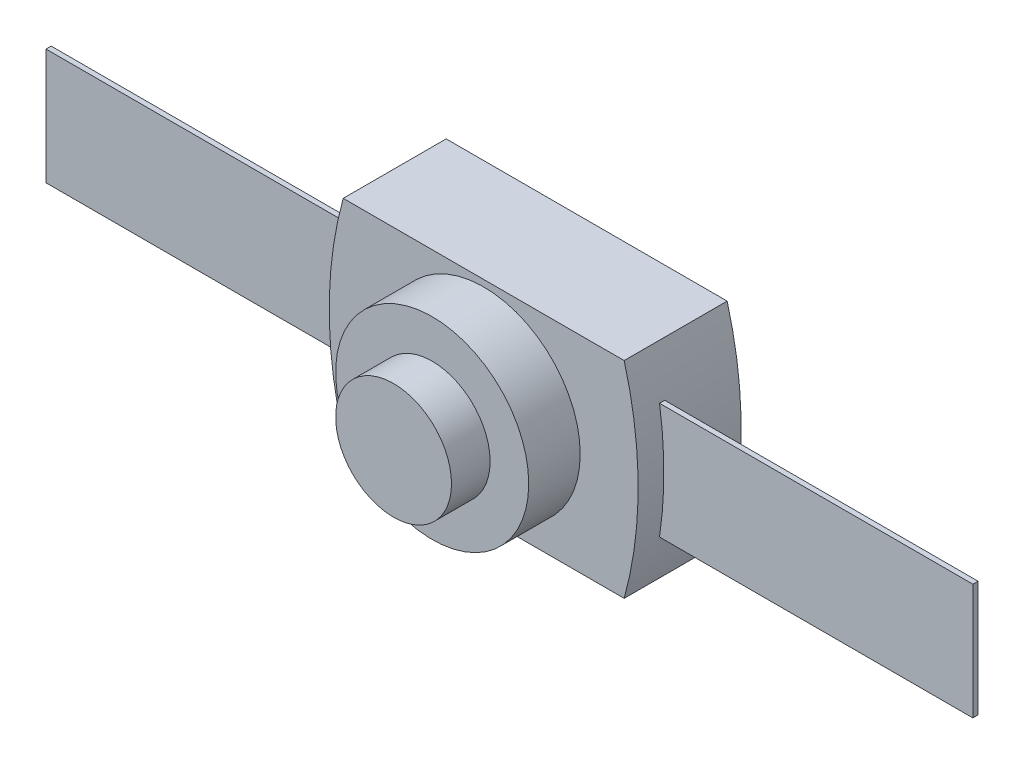
ISO-10303-21;
HEADER;
FILE_DESCRIPTION(('STEP AP214'),'2;1');
FILE_NAME('part.step','',(''),(''),'','','');
FILE_SCHEMA(('AUTOMOTIVE_DESIGN { 1 0 10303 214 1 1 1 1 }'));
ENDSEC;
DATA;
#1=APPLICATION_CONTEXT('core data for automotive mechanical design processes');
#2=APPLICATION_PROTOCOL_DEFINITION('international standard','automotive_design',2000,#1);
#3=PRODUCT_CONTEXT('',#1,'mechanical');
#4=PRODUCT('Part','Part','',(#3));
#5=PRODUCT_RELATED_PRODUCT_CATEGORY('part','',(#4));
#6=PRODUCT_DEFINITION_FORMATION('','',#4);
#7=PRODUCT_DEFINITION_CONTEXT('part definition',#1,'design');
#8=PRODUCT_DEFINITION('design','',#6,#7);
#9=PRODUCT_DEFINITION_SHAPE('','',#8);
#10=(LENGTH_UNIT() NAMED_UNIT(*) SI_UNIT(.MILLI.,.METRE.));
#11=(NAMED_UNIT(*) PLANE_ANGLE_UNIT() SI_UNIT($,.RADIAN.));
#12=(NAMED_UNIT(*) SI_UNIT($,.STERADIAN.) SOLID_ANGLE_UNIT());
#13=UNCERTAINTY_MEASURE_WITH_UNIT(LENGTH_MEASURE(1.E-05),#10,'distance_accuracy_value','');
#14=(GEOMETRIC_REPRESENTATION_CONTEXT(3) GLOBAL_UNCERTAINTY_ASSIGNED_CONTEXT((#13)) GLOBAL_UNIT_ASSIGNED_CONTEXT((#10,
#11,#12)) REPRESENTATION_CONTEXT('',''));
#15=CARTESIAN_POINT('',(0.,0.,0.));
#16=DIRECTION('',(0.,0.,1.));
#17=DIRECTION('',(1.,0.,0.));
#18=AXIS2_PLACEMENT_3D('',#15,#16,#17);
#19=CARTESIAN_POINT('',(15.,-4.,4.));
#20=DIRECTION('',(0.,0.,-1.));
#21=DIRECTION('',(-1.,0.,0.));
#22=AXIS2_PLACEMENT_3D('',#19,#20,#21);
#23=CYLINDRICAL_SURFACE('',#22,15.);
#24=CARTESIAN_POINT('',(15.,-4.,0.));
#25=DIRECTION('',(0.,0.,1.));
#26=DIRECTION('',(1.,0.,0.));
#27=AXIS2_PLACEMENT_3D('',#24,#25,#26);
#28=CIRCLE('',#27,15.);
#29=CARTESIAN_POINT('',(0.54316770519904,0.,0.));
#30=VERTEX_POINT('',#29);
#31=CARTESIAN_POINT('',(0.54316770519904,-8.,0.));
#32=VERTEX_POINT('',#31);
#33=EDGE_CURVE('E191',#30,#32,#28,.T.);
#34=ORIENTED_EDGE('',*,*,#33,.T.);
#35=DIRECTION('',(0.,0.,-1.));
#36=VECTOR('',#35,1.);
#37=CARTESIAN_POINT('',(0.54316770519904,-8.,4.));
#38=LINE('',#37,#36);
#39=CARTESIAN_POINT('',(0.54316770519904,-8.,4.));
#40=VERTEX_POINT('',#39);
#41=EDGE_CURVE('E201',#40,#32,#38,.T.);
#42=ORIENTED_EDGE('',*,*,#41,.F.);
#43=CARTESIAN_POINT('',(15.,-4.,4.));
#44=DIRECTION('',(0.,0.,1.));
#45=DIRECTION('',(1.,0.,0.));
#46=AXIS2_PLACEMENT_3D('',#43,#44,#45);
#47=CIRCLE('',#46,15.);
#48=CARTESIAN_POINT('',(0.54316770519904,0.,4.));
#49=VERTEX_POINT('',#48);
#50=EDGE_CURVE('E180',#49,#40,#47,.T.);
#51=ORIENTED_EDGE('',*,*,#50,.F.);
#52=DIRECTION('',(0.,0.,-1.));
#53=VECTOR('',#52,1.);
#54=CARTESIAN_POINT('',(0.54316770519904,0.,4.));
#55=LINE('',#54,#53);
#56=EDGE_CURVE('E176',#49,#30,#55,.T.);
#57=ORIENTED_EDGE('',*,*,#56,.T.);
#58=EDGE_LOOP('',(#34,#42,#51,#57));
#59=FACE_BOUND('',#58,.T.);
#60=CARTESIAN_POINT('',(15.,-4.,2.8));
#61=DIRECTION('',(0.,0.,1.));
#62=DIRECTION('',(1.,0.,0.));
#63=AXIS2_PLACEMENT_3D('',#60,#61,#62);
#64=CIRCLE('',#63,15.);
#65=CARTESIAN_POINT('',(0.169710050036109,-1.75,2.8));
#66=VERTEX_POINT('',#65);
#67=CARTESIAN_POINT('',(0.169710050036109,-6.25,2.8));
#68=VERTEX_POINT('',#67);
#69=EDGE_CURVE('E150',#66,#68,#64,.T.);
#70=ORIENTED_EDGE('',*,*,#69,.F.);
#71=DIRECTION('',(0.,0.,-1.));
#72=VECTOR('',#71,1.);
#73=CARTESIAN_POINT('',(0.169710050036109,-1.75,4.));
#74=LINE('',#73,#72);
#75=CARTESIAN_POINT('',(0.169710050036109,-1.75,3.));
#76=VERTEX_POINT('',#75);
#77=EDGE_CURVE('E158',#76,#66,#74,.T.);
#78=ORIENTED_EDGE('',*,*,#77,.F.);
#79=CARTESIAN_POINT('',(15.,-4.,3.));
#80=DIRECTION('',(0.,0.,1.));
#81=DIRECTION('',(1.,0.,0.));
#82=AXIS2_PLACEMENT_3D('',#79,#80,#81);
#83=CIRCLE('',#82,15.);
#84=CARTESIAN_POINT('',(0.169710050036109,-6.25,3.));
#85=VERTEX_POINT('',#84);
#86=EDGE_CURVE('E146',#76,#85,#83,.T.);
#87=ORIENTED_EDGE('',*,*,#86,.T.);
#88=DIRECTION('',(0.,0.,-1.));
#89=VECTOR('',#88,1.);
#90=CARTESIAN_POINT('',(0.169710050036109,-6.25,4.));
#91=LINE('',#90,#89);
#92=EDGE_CURVE('E160',#68,#85,#91,.F.);
#93=ORIENTED_EDGE('',*,*,#92,.F.);
#94=EDGE_LOOP('',(#70,#78,#87,#93));
#95=FACE_BOUND('',#94,.T.);
#96=ADVANCED_FACE('F35',(#59,#95),#23,.T.);
#97=CARTESIAN_POINT('',(-3.,-4.,4.));
#98=DIRECTION('',(0.,0.,-1.));
#99=DIRECTION('',(-1.,0.,0.));
#100=AXIS2_PLACEMENT_3D('',#97,#98,#99);
#101=CYLINDRICAL_SURFACE('',#100,15.);
#102=CARTESIAN_POINT('',(-3.,-4.,0.));
#103=DIRECTION('',(0.,0.,1.));
#104=DIRECTION('',(1.,0.,0.));
#105=AXIS2_PLACEMENT_3D('',#102,#103,#104);
#106=CIRCLE('',#105,15.);
#107=CARTESIAN_POINT('',(11.456832294801,0.,0.));
#108=VERTEX_POINT('',#107);
#109=CARTESIAN_POINT('',(11.456832294801,-8.,0.));
#110=VERTEX_POINT('',#109);
#111=EDGE_CURVE('E181',#108,#110,#106,.F.);
#112=ORIENTED_EDGE('',*,*,#111,.F.);
#113=DIRECTION('',(0.,0.,-1.));
#114=VECTOR('',#113,1.);
#115=CARTESIAN_POINT('',(11.456832294801,0.,4.));
#116=LINE('',#115,#114);
#117=CARTESIAN_POINT('',(11.456832294801,0.,4.));
#118=VERTEX_POINT('',#117);
#119=EDGE_CURVE('E188',#118,#108,#116,.T.);
#120=ORIENTED_EDGE('',*,*,#119,.F.);
#121=CARTESIAN_POINT('',(-3.,-4.,4.));
#122=DIRECTION('',(0.,0.,1.));
#123=DIRECTION('',(1.,0.,0.));
#124=AXIS2_PLACEMENT_3D('',#121,#122,#123);
#125=CIRCLE('',#124,15.);
#126=CARTESIAN_POINT('',(11.456832294801,-8.,4.));
#127=VERTEX_POINT('',#126);
#128=EDGE_CURVE('E185',#118,#127,#125,.F.);
#129=ORIENTED_EDGE('',*,*,#128,.T.);
#130=DIRECTION('',(0.,0.,-1.));
#131=VECTOR('',#130,1.);
#132=CARTESIAN_POINT('',(11.456832294801,-8.,4.));
#133=LINE('',#132,#131);
#134=EDGE_CURVE('E199',#127,#110,#133,.T.);
#135=ORIENTED_EDGE('',*,*,#134,.T.);
#136=EDGE_LOOP('',(#112,#120,#129,#135));
#137=FACE_BOUND('',#136,.T.);
#138=DIRECTION('',(0.,0.,-1.));
#139=VECTOR('',#138,1.);
#140=CARTESIAN_POINT('',(11.8302899499639,-1.75,4.));
#141=LINE('',#140,#139);
#142=CARTESIAN_POINT('',(11.8302899499639,-1.75,3.));
#143=VERTEX_POINT('',#142);
#144=CARTESIAN_POINT('',(11.8302899499639,-1.75,2.8));
#145=VERTEX_POINT('',#144);
#146=EDGE_CURVE('E207',#143,#145,#141,.T.);
#147=ORIENTED_EDGE('',*,*,#146,.T.);
#148=CARTESIAN_POINT('',(-3.,-4.,2.8));
#149=DIRECTION('',(0.,0.,1.));
#150=DIRECTION('',(1.,0.,0.));
#151=AXIS2_PLACEMENT_3D('',#148,#149,#150);
#152=CIRCLE('',#151,15.);
#153=CARTESIAN_POINT('',(11.8302899499639,-6.25,2.8));
#154=VERTEX_POINT('',#153);
#155=EDGE_CURVE('E11',#145,#154,#152,.F.);
#156=ORIENTED_EDGE('',*,*,#155,.T.);
#157=DIRECTION('',(0.,0.,-1.));
#158=VECTOR('',#157,1.);
#159=CARTESIAN_POINT('',(11.8302899499639,-6.25,4.));
#160=LINE('',#159,#158);
#161=CARTESIAN_POINT('',(11.8302899499639,-6.25,3.));
#162=VERTEX_POINT('',#161);
#163=EDGE_CURVE('E43',#154,#162,#160,.F.);
#164=ORIENTED_EDGE('',*,*,#163,.T.);
#165=CARTESIAN_POINT('',(-3.,-4.,3.));
#166=DIRECTION('',(0.,0.,1.));
#167=DIRECTION('',(1.,0.,0.));
#168=AXIS2_PLACEMENT_3D('',#165,#166,#167);
#169=CIRCLE('',#168,15.);
#170=EDGE_CURVE('E169',#143,#162,#169,.F.);
#171=ORIENTED_EDGE('',*,*,#170,.F.);
#172=EDGE_LOOP('',(#147,#156,#164,#171));
#173=FACE_BOUND('',#172,.T.);
#174=ADVANCED_FACE('F208',(#137,#173),#101,.T.);
#175=CARTESIAN_POINT('',(0.,0.,4.));
#176=DIRECTION('',(0.,1.,0.));
#177=DIRECTION('',(0.,0.,1.));
#178=AXIS2_PLACEMENT_3D('',#175,#176,#177);
#179=PLANE('',#178);
#180=DIRECTION('',(1.,0.,0.));
#181=VECTOR('',#180,1.);
#182=CARTESIAN_POINT('',(0.,0.,0.));
#183=LINE('',#182,#181);
#184=EDGE_CURVE('E173',#30,#108,#183,.T.);
#185=ORIENTED_EDGE('',*,*,#184,.F.);
#186=ORIENTED_EDGE('',*,*,#56,.F.);
#187=DIRECTION('',(1.,0.,0.));
#188=VECTOR('',#187,1.);
#189=CARTESIAN_POINT('',(0.,0.,4.));
#190=LINE('',#189,#188);
#191=EDGE_CURVE('E177',#49,#118,#190,.T.);
#192=ORIENTED_EDGE('',*,*,#191,.T.);
#193=ORIENTED_EDGE('',*,*,#119,.T.);
#194=EDGE_LOOP('',(#185,#186,#192,#193));
#195=FACE_BOUND('',#194,.T.);
#196=ADVANCED_FACE('F37',(#195),#179,.T.);
#197=CARTESIAN_POINT('',(0.,-8.,4.));
#198=DIRECTION('',(0.,1.,0.));
#199=DIRECTION('',(0.,0.,1.));
#200=AXIS2_PLACEMENT_3D('',#197,#198,#199);
#201=PLANE('',#200);
#202=DIRECTION('',(1.,0.,0.));
#203=VECTOR('',#202,1.);
#204=CARTESIAN_POINT('',(0.,-8.,0.));
#205=LINE('',#204,#203);
#206=EDGE_CURVE('E193',#32,#110,#205,.T.);
#207=ORIENTED_EDGE('',*,*,#206,.T.);
#208=ORIENTED_EDGE('',*,*,#134,.F.);
#209=DIRECTION('',(1.,0.,0.));
#210=VECTOR('',#209,1.);
#211=CARTESIAN_POINT('',(0.,-8.,4.));
#212=LINE('',#211,#210);
#213=EDGE_CURVE('E183',#40,#127,#212,.T.);
#214=ORIENTED_EDGE('',*,*,#213,.F.);
#215=ORIENTED_EDGE('',*,*,#41,.T.);
#216=EDGE_LOOP('',(#207,#208,#214,#215));
#217=FACE_BOUND('',#216,.T.);
#218=ADVANCED_FACE('F265',(#217),#201,.F.);
#219=CARTESIAN_POINT('',(0.,0.,4.));
#220=DIRECTION('',(0.,0.,1.));
#221=DIRECTION('',(1.,0.,0.));
#222=AXIS2_PLACEMENT_3D('',#219,#220,#221);
#223=PLANE('',#222);
#224=CARTESIAN_POINT('',(6.,-4.,4.));
#225=DIRECTION('',(0.,0.,1.));
#226=DIRECTION('',(1.,0.,0.));
#227=AXIS2_PLACEMENT_3D('',#224,#225,#226);
#228=CIRCLE('',#227,3.75);
#229=CARTESIAN_POINT('',(9.75,-4.,4.));
#230=VERTEX_POINT('',#229);
#231=EDGE_CURVE('E170',#230,#230,#228,.T.);
#232=ORIENTED_EDGE('',*,*,#231,.F.);
#233=EDGE_LOOP('',(#232));
#234=FACE_BOUND('',#233,.T.);
#235=ORIENTED_EDGE('',*,*,#191,.F.);
#236=ORIENTED_EDGE('',*,*,#50,.T.);
#237=ORIENTED_EDGE('',*,*,#213,.T.);
#238=ORIENTED_EDGE('',*,*,#128,.F.);
#239=EDGE_LOOP('',(#235,#236,#237,#238));
#240=FACE_BOUND('',#239,.T.);
#241=ADVANCED_FACE('F267',(#234,#240),#223,.T.);
#242=CARTESIAN_POINT('',(0.,0.,0.));
#243=DIRECTION('',(0.,0.,1.));
#244=DIRECTION('',(1.,0.,0.));
#245=AXIS2_PLACEMENT_3D('',#242,#243,#244);
#246=PLANE('',#245);
#247=ORIENTED_EDGE('',*,*,#184,.T.);
#248=ORIENTED_EDGE('',*,*,#111,.T.);
#249=ORIENTED_EDGE('',*,*,#206,.F.);
#250=ORIENTED_EDGE('',*,*,#33,.F.);
#251=EDGE_LOOP('',(#247,#248,#249,#250));
#252=FACE_BOUND('',#251,.T.);
#253=ADVANCED_FACE('F270',(#252),#246,.F.);
#254=CARTESIAN_POINT('',(6.,-4.,6.));
#255=DIRECTION('',(0.,0.,-1.));
#256=DIRECTION('',(-1.,0.,0.));
#257=AXIS2_PLACEMENT_3D('',#254,#255,#256);
#258=CYLINDRICAL_SURFACE('',#257,3.75);
#259=CARTESIAN_POINT('',(6.,-4.,6.));
#260=DIRECTION('',(0.,0.,1.));
#261=DIRECTION('',(1.,0.,0.));
#262=AXIS2_PLACEMENT_3D('',#259,#260,#261);
#263=CIRCLE('',#262,3.75);
#264=CARTESIAN_POINT('',(9.75,-4.,6.));
#265=VERTEX_POINT('',#264);
#266=EDGE_CURVE('E165',#265,#265,#263,.T.);
#267=ORIENTED_EDGE('',*,*,#266,.F.);
#268=EDGE_LOOP('',(#267));
#269=FACE_BOUND('',#268,.T.);
#270=ORIENTED_EDGE('',*,*,#231,.T.);
#271=EDGE_LOOP('',(#270));
#272=FACE_BOUND('',#271,.T.);
#273=ADVANCED_FACE('F273',(#269,#272),#258,.T.);
#274=CARTESIAN_POINT('',(6.,-4.,6.));
#275=DIRECTION('',(0.,0.,1.));
#276=DIRECTION('',(1.,0.,0.));
#277=AXIS2_PLACEMENT_3D('',#274,#275,#276);
#278=PLANE('',#277);
#279=CARTESIAN_POINT('',(6.,-4.,6.));
#280=DIRECTION('',(0.,0.,1.));
#281=DIRECTION('',(1.,0.,0.));
#282=AXIS2_PLACEMENT_3D('',#279,#280,#281);
#283=CIRCLE('',#282,2.25);
#284=CARTESIAN_POINT('',(8.25,-4.,6.));
#285=VERTEX_POINT('',#284);
#286=EDGE_CURVE('E166',#285,#285,#283,.T.);
#287=ORIENTED_EDGE('',*,*,#286,.F.);
#288=EDGE_LOOP('',(#287));
#289=FACE_BOUND('',#288,.T.);
#290=ORIENTED_EDGE('',*,*,#266,.T.);
#291=EDGE_LOOP('',(#290));
#292=FACE_BOUND('',#291,.T.);
#293=ADVANCED_FACE('F280',(#289,#292),#278,.T.);
#294=CARTESIAN_POINT('',(6.,-4.,7.5));
#295=DIRECTION('',(0.,0.,-1.));
#296=DIRECTION('',(-1.,0.,0.));
#297=AXIS2_PLACEMENT_3D('',#294,#295,#296);
#298=CYLINDRICAL_SURFACE('',#297,2.25);
#299=CARTESIAN_POINT('',(6.,-4.,7.5));
#300=DIRECTION('',(0.,0.,1.));
#301=DIRECTION('',(1.,0.,0.));
#302=AXIS2_PLACEMENT_3D('',#299,#300,#301);
#303=CIRCLE('',#302,2.25);
#304=CARTESIAN_POINT('',(8.25,-4.,7.5));
#305=VERTEX_POINT('',#304);
#306=EDGE_CURVE('E162',#305,#305,#303,.T.);
#307=ORIENTED_EDGE('',*,*,#306,.F.);
#308=EDGE_LOOP('',(#307));
#309=FACE_BOUND('',#308,.T.);
#310=ORIENTED_EDGE('',*,*,#286,.T.);
#311=EDGE_LOOP('',(#310));
#312=FACE_BOUND('',#311,.T.);
#313=ADVANCED_FACE('F284',(#309,#312),#298,.T.);
#314=CARTESIAN_POINT('',(6.,-4.,7.5));
#315=DIRECTION('',(0.,0.,1.));
#316=DIRECTION('',(1.,0.,0.));
#317=AXIS2_PLACEMENT_3D('',#314,#315,#316);
#318=PLANE('',#317);
#319=ORIENTED_EDGE('',*,*,#306,.T.);
#320=EDGE_LOOP('',(#319));
#321=FACE_BOUND('',#320,.T.);
#322=ADVANCED_FACE('F288',(#321),#318,.T.);
#323=CARTESIAN_POINT('',(24.,-6.25,2.8));
#324=DIRECTION('',(-1.,0.,0.));
#325=DIRECTION('',(0.,0.,1.));
#326=AXIS2_PLACEMENT_3D('',#323,#324,#325);
#327=PLANE('',#326);
#328=DIRECTION('',(0.,-1.,0.));
#329=VECTOR('',#328,1.);
#330=CARTESIAN_POINT('',(24.,-6.25,3.));
#331=LINE('',#330,#329);
#332=CARTESIAN_POINT('',(24.,-1.75,3.));
#333=VERTEX_POINT('',#332);
#334=CARTESIAN_POINT('',(24.,-6.25,3.));
#335=VERTEX_POINT('',#334);
#336=EDGE_CURVE('E145',#333,#335,#331,.T.);
#337=ORIENTED_EDGE('',*,*,#336,.T.);
#338=DIRECTION('',(0.,0.,1.));
#339=VECTOR('',#338,1.);
#340=CARTESIAN_POINT('',(24.,-6.25,2.8));
#341=LINE('',#340,#339);
#342=CARTESIAN_POINT('',(24.,-6.25,2.8));
#343=VERTEX_POINT('',#342);
#344=EDGE_CURVE('E127',#343,#335,#341,.T.);
#345=ORIENTED_EDGE('',*,*,#344,.F.);
#346=DIRECTION('',(0.,-1.,0.));
#347=VECTOR('',#346,1.);
#348=CARTESIAN_POINT('',(24.,-6.25,2.8));
#349=LINE('',#348,#347);
#350=CARTESIAN_POINT('',(24.,-1.75,2.8));
#351=VERTEX_POINT('',#350);
#352=EDGE_CURVE('E134',#351,#343,#349,.T.);
#353=ORIENTED_EDGE('',*,*,#352,.F.);
#354=DIRECTION('',(0.,0.,1.));
#355=VECTOR('',#354,1.);
#356=CARTESIAN_POINT('',(24.,-1.75,2.8));
#357=LINE('',#356,#355);
#358=EDGE_CURVE('E223',#351,#333,#357,.T.);
#359=ORIENTED_EDGE('',*,*,#358,.T.);
#360=EDGE_LOOP('',(#337,#345,#353,#359));
#361=FACE_BOUND('',#360,.T.);
#362=ADVANCED_FACE('F143',(#361),#327,.F.);
#363=CARTESIAN_POINT('',(0.,0.,2.8));
#364=DIRECTION('',(0.,0.,1.));
#365=DIRECTION('',(1.,0.,0.));
#366=AXIS2_PLACEMENT_3D('',#363,#364,#365);
#367=PLANE('',#366);
#368=ORIENTED_EDGE('',*,*,#155,.F.);
#369=DIRECTION('',(1.,0.,0.));
#370=VECTOR('',#369,1.);
#371=CARTESIAN_POINT('',(24.,-1.75,2.8));
#372=LINE('',#371,#370);
#373=EDGE_CURVE('E137',#145,#351,#372,.T.);
#374=ORIENTED_EDGE('',*,*,#373,.T.);
#375=ORIENTED_EDGE('',*,*,#352,.T.);
#376=DIRECTION('',(-1.,0.,0.));
#377=VECTOR('',#376,1.);
#378=CARTESIAN_POINT('',(24.,-6.25,2.8));
#379=LINE('',#378,#377);
#380=EDGE_CURVE('E122',#343,#154,#379,.T.);
#381=ORIENTED_EDGE('',*,*,#380,.T.);
#382=EDGE_LOOP('',(#368,#374,#375,#381));
#383=FACE_BOUND('',#382,.T.);
#384=ADVANCED_FACE('F135',(#383),#367,.F.);
#385=CARTESIAN_POINT('',(0.,0.,3.));
#386=DIRECTION('',(0.,0.,1.));
#387=DIRECTION('',(1.,0.,0.));
#388=AXIS2_PLACEMENT_3D('',#385,#386,#387);
#389=PLANE('',#388);
#390=DIRECTION('',(1.,0.,0.));
#391=VECTOR('',#390,1.);
#392=CARTESIAN_POINT('',(24.,-1.75,3.));
#393=LINE('',#392,#391);
#394=EDGE_CURVE('E214',#143,#333,#393,.T.);
#395=ORIENTED_EDGE('',*,*,#394,.F.);
#396=ORIENTED_EDGE('',*,*,#170,.T.);
#397=DIRECTION('',(-1.,0.,0.));
#398=VECTOR('',#397,1.);
#399=CARTESIAN_POINT('',(24.,-6.25,3.));
#400=LINE('',#399,#398);
#401=EDGE_CURVE('E213',#335,#162,#400,.T.);
#402=ORIENTED_EDGE('',*,*,#401,.F.);
#403=ORIENTED_EDGE('',*,*,#336,.F.);
#404=EDGE_LOOP('',(#395,#396,#402,#403));
#405=FACE_BOUND('',#404,.T.);
#406=ADVANCED_FACE('F212',(#405),#389,.T.);
#407=CARTESIAN_POINT('',(24.,-1.75,2.8));
#408=DIRECTION('',(0.,-1.,0.));
#409=DIRECTION('',(0.,0.,-1.));
#410=AXIS2_PLACEMENT_3D('',#407,#408,#409);
#411=PLANE('',#410);
#412=ORIENTED_EDGE('',*,*,#146,.F.);
#413=ORIENTED_EDGE('',*,*,#394,.T.);
#414=ORIENTED_EDGE('',*,*,#358,.F.);
#415=ORIENTED_EDGE('',*,*,#373,.F.);
#416=EDGE_LOOP('',(#412,#413,#414,#415));
#417=FACE_BOUND('',#416,.T.);
#418=ADVANCED_FACE('F254',(#417),#411,.F.);
#419=CARTESIAN_POINT('',(24.,-6.25,2.8));
#420=DIRECTION('',(0.,1.,0.));
#421=DIRECTION('',(0.,0.,1.));
#422=AXIS2_PLACEMENT_3D('',#419,#420,#421);
#423=PLANE('',#422);
#424=ORIENTED_EDGE('',*,*,#163,.F.);
#425=ORIENTED_EDGE('',*,*,#380,.F.);
#426=ORIENTED_EDGE('',*,*,#344,.T.);
#427=ORIENTED_EDGE('',*,*,#401,.T.);
#428=EDGE_LOOP('',(#424,#425,#426,#427));
#429=FACE_BOUND('',#428,.T.);
#430=ADVANCED_FACE('F124',(#429),#423,.F.);
#431=CARTESIAN_POINT('',(-12.,-6.25,2.8));
#432=VERTEX_POINT('',#431);
#433=EDGE_CURVE('E131',#68,#432,#379,.T.);
#434=ORIENTED_EDGE('',*,*,#433,.F.);
#435=ORIENTED_EDGE('',*,*,#92,.T.);
#436=CARTESIAN_POINT('',(-12.,-6.25,3.));
#437=VERTEX_POINT('',#436);
#438=EDGE_CURVE('E50',#85,#437,#400,.T.);
#439=ORIENTED_EDGE('',*,*,#438,.T.);
#440=DIRECTION('',(0.,0.,1.));
#441=VECTOR('',#440,1.);
#442=CARTESIAN_POINT('',(-12.,-6.25,2.8));
#443=LINE('',#442,#441);
#444=EDGE_CURVE('E147',#432,#437,#443,.T.);
#445=ORIENTED_EDGE('',*,*,#444,.F.);
#446=EDGE_LOOP('',(#434,#435,#439,#445));
#447=FACE_BOUND('',#446,.T.);
#448=ADVANCED_FACE('F246',(#447),#423,.F.);
#449=CARTESIAN_POINT('',(-12.,-1.75,3.));
#450=VERTEX_POINT('',#449);
#451=EDGE_CURVE('E141',#450,#76,#393,.T.);
#452=ORIENTED_EDGE('',*,*,#451,.T.);
#453=ORIENTED_EDGE('',*,*,#77,.T.);
#454=CARTESIAN_POINT('',(-12.,-1.75,2.8));
#455=VERTEX_POINT('',#454);
#456=EDGE_CURVE('E224',#455,#66,#372,.T.);
#457=ORIENTED_EDGE('',*,*,#456,.F.);
#458=DIRECTION('',(0.,0.,1.));
#459=VECTOR('',#458,1.);
#460=CARTESIAN_POINT('',(-12.,-1.75,2.8));
#461=LINE('',#460,#459);
#462=EDGE_CURVE('E153',#455,#450,#461,.T.);
#463=ORIENTED_EDGE('',*,*,#462,.T.);
#464=EDGE_LOOP('',(#452,#453,#457,#463));
#465=FACE_BOUND('',#464,.T.);
#466=ADVANCED_FACE('F230',(#465),#411,.F.);
#467=ORIENTED_EDGE('',*,*,#456,.T.);
#468=ORIENTED_EDGE('',*,*,#69,.T.);
#469=ORIENTED_EDGE('',*,*,#433,.T.);
#470=DIRECTION('',(0.,1.,0.));
#471=VECTOR('',#470,1.);
#472=CARTESIAN_POINT('',(-12.,-6.25,2.8));
#473=LINE('',#472,#471);
#474=EDGE_CURVE('E130',#432,#455,#473,.T.);
#475=ORIENTED_EDGE('',*,*,#474,.T.);
#476=EDGE_LOOP('',(#467,#468,#469,#475));
#477=FACE_BOUND('',#476,.T.);
#478=ADVANCED_FACE('F240',(#477),#367,.F.);
#479=ORIENTED_EDGE('',*,*,#86,.F.);
#480=ORIENTED_EDGE('',*,*,#451,.F.);
#481=DIRECTION('',(0.,1.,0.));
#482=VECTOR('',#481,1.);
#483=CARTESIAN_POINT('',(-12.,-6.25,3.));
#484=LINE('',#483,#482);
#485=EDGE_CURVE('E215',#437,#450,#484,.T.);
#486=ORIENTED_EDGE('',*,*,#485,.F.);
#487=ORIENTED_EDGE('',*,*,#438,.F.);
#488=EDGE_LOOP('',(#479,#480,#486,#487));
#489=FACE_BOUND('',#488,.T.);
#490=ADVANCED_FACE('F235',(#489),#389,.T.);
#491=CARTESIAN_POINT('',(-12.,-6.25,2.8));
#492=DIRECTION('',(1.,0.,0.));
#493=DIRECTION('',(0.,0.,-1.));
#494=AXIS2_PLACEMENT_3D('',#491,#492,#493);
#495=PLANE('',#494);
#496=ORIENTED_EDGE('',*,*,#485,.T.);
#497=ORIENTED_EDGE('',*,*,#462,.F.);
#498=ORIENTED_EDGE('',*,*,#474,.F.);
#499=ORIENTED_EDGE('',*,*,#444,.T.);
#500=EDGE_LOOP('',(#496,#497,#498,#499));
#501=FACE_BOUND('',#500,.T.);
#502=ADVANCED_FACE('F244',(#501),#495,.F.);
#503=CLOSED_SHELL('',(#96,#174,#196,#218,#241,#253,#273,#293,#313,#322,#362,#384,#406,#418,#430,
#448,#466,#478,#490,#502));
#504=MANIFOLD_SOLID_BREP('B2',#503);
#505=ADVANCED_BREP_SHAPE_REPRESENTATION('',(#18,#504),#14);
#506=SHAPE_DEFINITION_REPRESENTATION(#9,#505);
ENDSEC;
END-ISO-10303-21;
